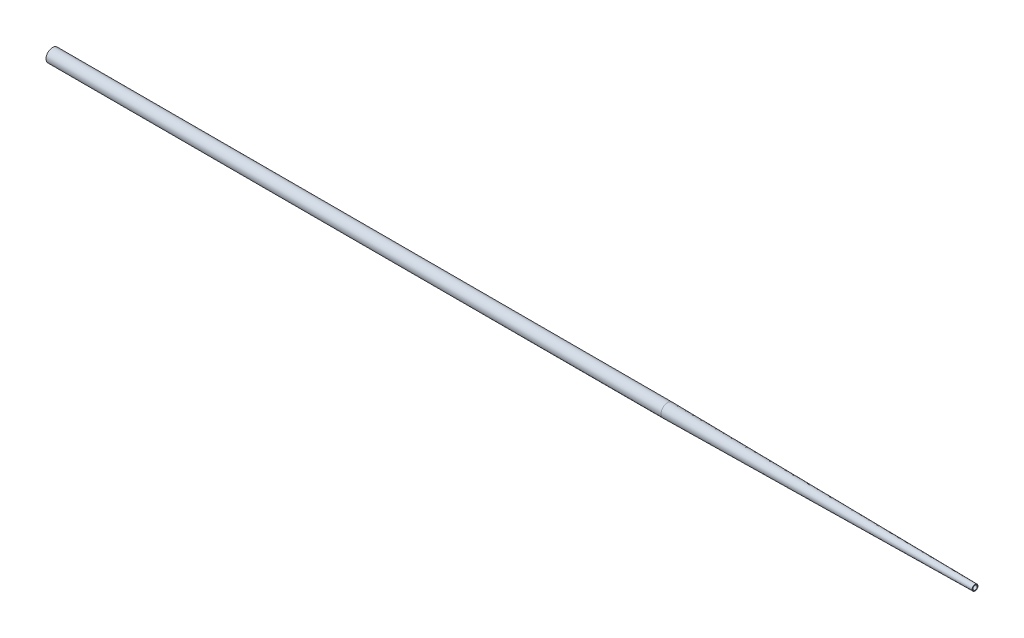
ISO-10303-21;
HEADER;
FILE_DESCRIPTION(('STEP AP214'),'2;1');
FILE_NAME('part.step','',(''),(''),'','','');
FILE_SCHEMA(('AUTOMOTIVE_DESIGN { 1 0 10303 214 1 1 1 1 }'));
ENDSEC;
DATA;
#1=APPLICATION_CONTEXT('core data for automotive mechanical design processes');
#2=APPLICATION_PROTOCOL_DEFINITION('international standard','automotive_design',2000,#1);
#3=PRODUCT_CONTEXT('',#1,'mechanical');
#4=PRODUCT('Part','Part','',(#3));
#5=PRODUCT_RELATED_PRODUCT_CATEGORY('part','',(#4));
#6=PRODUCT_DEFINITION_FORMATION('','',#4);
#7=PRODUCT_DEFINITION_CONTEXT('part definition',#1,'design');
#8=PRODUCT_DEFINITION('design','',#6,#7);
#9=PRODUCT_DEFINITION_SHAPE('','',#8);
#10=(LENGTH_UNIT() NAMED_UNIT(*) SI_UNIT(.MILLI.,.METRE.));
#11=(NAMED_UNIT(*) PLANE_ANGLE_UNIT() SI_UNIT($,.RADIAN.));
#12=(NAMED_UNIT(*) SI_UNIT($,.STERADIAN.) SOLID_ANGLE_UNIT());
#13=UNCERTAINTY_MEASURE_WITH_UNIT(LENGTH_MEASURE(1.E-05),#10,'distance_accuracy_value','');
#14=(GEOMETRIC_REPRESENTATION_CONTEXT(3) GLOBAL_UNCERTAINTY_ASSIGNED_CONTEXT((#13)) GLOBAL_UNIT_ASSIGNED_CONTEXT((#10,
#11,#12)) REPRESENTATION_CONTEXT('',''));
#15=CARTESIAN_POINT('',(0.,0.,0.));
#16=DIRECTION('',(0.,0.,1.));
#17=DIRECTION('',(1.,0.,0.));
#18=AXIS2_PLACEMENT_3D('',#15,#16,#17);
#19=CARTESIAN_POINT('',(-229.207509753787,0.,-14.0142147668084));
#20=DIRECTION('',(-1.,0.,0.));
#21=DIRECTION('',(0.,0.,1.));
#22=AXIS2_PLACEMENT_3D('',#19,#20,#21);
#23=CYLINDRICAL_SURFACE('',#22,8.50000000000005);
#24=CARTESIAN_POINT('',(-225.35052801552,0.,-14.0142147668084));
#25=DIRECTION('',(-1.,0.,0.));
#26=DIRECTION('',(0.,0.,1.));
#27=AXIS2_PLACEMENT_3D('',#24,#25,#26);
#28=CIRCLE('',#27,8.5);
#29=CARTESIAN_POINT('',(-225.35052801552,0.,-5.51421476680839));
#30=VERTEX_POINT('',#29);
#31=EDGE_CURVE('E10',#30,#30,#28,.T.);
#32=ORIENTED_EDGE('',*,*,#31,.F.);
#33=EDGE_LOOP('',(#32));
#34=FACE_BOUND('',#33,.T.);
#35=CARTESIAN_POINT('',(574.64947198448,0.,-14.0142147668084));
#36=DIRECTION('',(-1.,0.,0.));
#37=DIRECTION('',(0.,0.,1.));
#38=AXIS2_PLACEMENT_3D('',#35,#36,#37);
#39=CIRCLE('',#38,8.5000000000001);
#40=CARTESIAN_POINT('',(574.64947198448,0.,-5.5142147668083));
#41=VERTEX_POINT('',#40);
#42=EDGE_CURVE('E64',#41,#41,#39,.T.);
#43=ORIENTED_EDGE('',*,*,#42,.T.);
#44=EDGE_LOOP('',(#43));
#45=FACE_BOUND('',#44,.T.);
#46=ADVANCED_FACE('F37',(#34,#45),#23,.T.);
#47=CARTESIAN_POINT('',(-225.35052801552,0.,-22.5142147668084));
#48=DIRECTION('',(1.,0.,0.));
#49=DIRECTION('',(0.,0.,-1.));
#50=AXIS2_PLACEMENT_3D('',#47,#48,#49);
#51=PLANE('',#50);
#52=CARTESIAN_POINT('',(-225.35052801552,0.,-14.0142147668084));
#53=DIRECTION('',(-1.,0.,0.));
#54=DIRECTION('',(0.,0.,1.));
#55=AXIS2_PLACEMENT_3D('',#52,#53,#54);
#56=CIRCLE('',#55,7.5);
#57=CARTESIAN_POINT('',(-225.35052801552,0.,-6.5142147668084));
#58=VERTEX_POINT('',#57);
#59=EDGE_CURVE('E44',#58,#58,#56,.T.);
#60=ORIENTED_EDGE('',*,*,#59,.F.);
#61=EDGE_LOOP('',(#60));
#62=FACE_BOUND('',#61,.T.);
#63=ORIENTED_EDGE('',*,*,#31,.T.);
#64=EDGE_LOOP('',(#63));
#65=FACE_BOUND('',#64,.T.);
#66=ADVANCED_FACE('F90',(#62,#65),#51,.F.);
#67=CARTESIAN_POINT('',(-229.207509753787,0.,-14.0142147668084));
#68=DIRECTION('',(-1.,0.,0.));
#69=DIRECTION('',(0.,0.,1.));
#70=AXIS2_PLACEMENT_3D('',#67,#68,#69);
#71=CYLINDRICAL_SURFACE('',#70,7.5);
#72=CARTESIAN_POINT('',(574.64947198448,0.,-14.0142147668084));
#73=DIRECTION('',(-1.,0.,0.));
#74=DIRECTION('',(0.,0.,1.));
#75=AXIS2_PLACEMENT_3D('',#72,#73,#74);
#76=CIRCLE('',#75,7.5);
#77=CARTESIAN_POINT('',(574.64947198448,0.,-6.5142147668084));
#78=VERTEX_POINT('',#77);
#79=EDGE_CURVE('E49',#78,#78,#76,.T.);
#80=ORIENTED_EDGE('',*,*,#79,.F.);
#81=EDGE_LOOP('',(#80));
#82=FACE_BOUND('',#81,.T.);
#83=ORIENTED_EDGE('',*,*,#59,.T.);
#84=EDGE_LOOP('',(#83));
#85=FACE_BOUND('',#84,.T.);
#86=ADVANCED_FACE('F85',(#82,#85),#71,.F.);
#87=CARTESIAN_POINT('',(574.64947198448,0.,-14.0142147668084));
#88=DIRECTION('',(-1.,0.,0.));
#89=DIRECTION('',(0.,0.,1.));
#90=AXIS2_PLACEMENT_3D('',#87,#88,#89);
#91=CONICAL_SURFACE('',#90,7.5,0.0118044029707966);
#92=CARTESIAN_POINT('',(974.649471984481,0.,-14.0142147668084));
#93=DIRECTION('',(-1.,0.,0.));
#94=DIRECTION('',(0.,0.,1.));
#95=AXIS2_PLACEMENT_3D('',#92,#93,#94);
#96=CIRCLE('',#95,2.77801948320382);
#97=CARTESIAN_POINT('',(974.649471984481,0.,-11.2361952836046));
#98=VERTEX_POINT('',#97);
#99=EDGE_CURVE('E54',#98,#98,#96,.T.);
#100=ORIENTED_EDGE('',*,*,#99,.F.);
#101=EDGE_LOOP('',(#100));
#102=FACE_BOUND('',#101,.T.);
#103=ORIENTED_EDGE('',*,*,#79,.T.);
#104=EDGE_LOOP('',(#103));
#105=FACE_BOUND('',#104,.T.);
#106=ADVANCED_FACE('F79',(#102,#105),#91,.F.);
#107=CARTESIAN_POINT('',(974.64947198448,0.,-17.7922342500123));
#108=DIRECTION('',(-1.,0.,0.));
#109=DIRECTION('',(0.,0.,1.));
#110=AXIS2_PLACEMENT_3D('',#107,#108,#109);
#111=PLANE('',#110);
#112=CARTESIAN_POINT('',(974.64947198448,0.,-14.0142147668084));
#113=DIRECTION('',(-1.,0.,0.));
#114=DIRECTION('',(0.,0.,1.));
#115=AXIS2_PLACEMENT_3D('',#112,#113,#114);
#116=CIRCLE('',#115,3.77801948320392);
#117=CARTESIAN_POINT('',(974.64947198448,0.,-10.2361952836045));
#118=VERTEX_POINT('',#117);
#119=EDGE_CURVE('E60',#118,#118,#116,.T.);
#120=ORIENTED_EDGE('',*,*,#119,.F.);
#121=EDGE_LOOP('',(#120));
#122=FACE_BOUND('',#121,.T.);
#123=ORIENTED_EDGE('',*,*,#99,.T.);
#124=EDGE_LOOP('',(#123));
#125=FACE_BOUND('',#124,.T.);
#126=ADVANCED_FACE('F73',(#122,#125),#111,.F.);
#127=CARTESIAN_POINT('',(974.64947198448,0.,-14.0142147668084));
#128=DIRECTION('',(-1.,0.,0.));
#129=DIRECTION('',(0.,0.,1.));
#130=AXIS2_PLACEMENT_3D('',#127,#128,#129);
#131=CONICAL_SURFACE('',#130,3.77801948320392,0.0118044029707966);
#132=ORIENTED_EDGE('',*,*,#42,.F.);
#133=EDGE_LOOP('',(#132));
#134=FACE_BOUND('',#133,.T.);
#135=ORIENTED_EDGE('',*,*,#119,.T.);
#136=EDGE_LOOP('',(#135));
#137=FACE_BOUND('',#136,.T.);
#138=ADVANCED_FACE('F70',(#134,#137),#131,.T.);
#139=CLOSED_SHELL('',(#46,#66,#86,#106,#126,#138));
#140=MANIFOLD_SOLID_BREP('B2',#139);
#141=ADVANCED_BREP_SHAPE_REPRESENTATION('',(#18,#140),#14);
#142=SHAPE_DEFINITION_REPRESENTATION(#9,#141);
ENDSEC;
END-ISO-10303-21;
